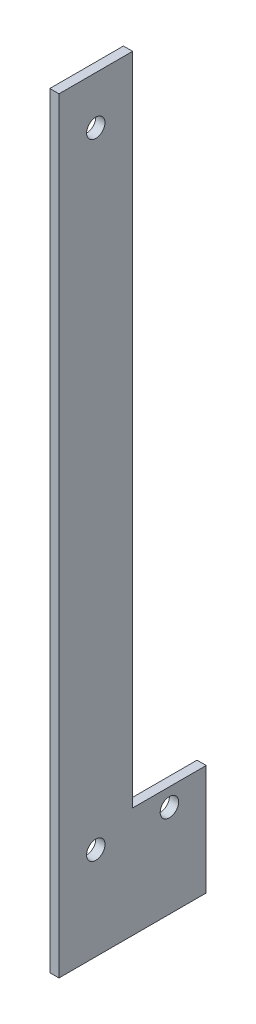
ISO-10303-21;
HEADER;
FILE_DESCRIPTION(('STEP AP214'),'2;1');
FILE_NAME('part.step','',(''),(''),'','','');
FILE_SCHEMA(('AUTOMOTIVE_DESIGN { 1 0 10303 214 1 1 1 1 }'));
ENDSEC;
DATA;
#1=APPLICATION_CONTEXT('core data for automotive mechanical design processes');
#2=APPLICATION_PROTOCOL_DEFINITION('international standard','automotive_design',2000,#1);
#3=PRODUCT_CONTEXT('',#1,'mechanical');
#4=PRODUCT('Part','Part','',(#3));
#5=PRODUCT_RELATED_PRODUCT_CATEGORY('part','',(#4));
#6=PRODUCT_DEFINITION_FORMATION('','',#4);
#7=PRODUCT_DEFINITION_CONTEXT('part definition',#1,'design');
#8=PRODUCT_DEFINITION('design','',#6,#7);
#9=PRODUCT_DEFINITION_SHAPE('','',#8);
#10=(LENGTH_UNIT() NAMED_UNIT(*) SI_UNIT(.MILLI.,.METRE.));
#11=(NAMED_UNIT(*) PLANE_ANGLE_UNIT() SI_UNIT($,.RADIAN.));
#12=(NAMED_UNIT(*) SI_UNIT($,.STERADIAN.) SOLID_ANGLE_UNIT());
#13=UNCERTAINTY_MEASURE_WITH_UNIT(LENGTH_MEASURE(1.E-05),#10,'distance_accuracy_value','');
#14=(GEOMETRIC_REPRESENTATION_CONTEXT(3) GLOBAL_UNCERTAINTY_ASSIGNED_CONTEXT((#13)) GLOBAL_UNIT_ASSIGNED_CONTEXT((#10,
#11,#12)) REPRESENTATION_CONTEXT('',''));
#15=CARTESIAN_POINT('',(0.,0.,0.));
#16=DIRECTION('',(0.,0.,1.));
#17=DIRECTION('',(1.,0.,0.));
#18=AXIS2_PLACEMENT_3D('',#15,#16,#17);
#19=CARTESIAN_POINT('',(3.175,38.1,-25.4));
#20=DIRECTION('',(0.,1.,0.));
#21=DIRECTION('',(0.,0.,1.));
#22=AXIS2_PLACEMENT_3D('',#19,#20,#21);
#23=PLANE('',#22);
#24=DIRECTION('',(0.,0.,-1.));
#25=VECTOR('',#24,1.);
#26=CARTESIAN_POINT('',(0.,38.1,-25.4));
#27=LINE('',#26,#25);
#28=CARTESIAN_POINT('',(0.,38.1,-25.4));
#29=VERTEX_POINT('',#28);
#30=CARTESIAN_POINT('',(0.,38.1,-50.8));
#31=VERTEX_POINT('',#30);
#32=EDGE_CURVE('E116',#29,#31,#27,.T.);
#33=ORIENTED_EDGE('',*,*,#32,.F.);
#34=DIRECTION('',(-1.,0.,0.));
#35=VECTOR('',#34,1.);
#36=CARTESIAN_POINT('',(3.175,38.1,-25.4));
#37=LINE('',#36,#35);
#38=CARTESIAN_POINT('',(3.175,38.1,-25.4));
#39=VERTEX_POINT('',#38);
#40=EDGE_CURVE('E11',#39,#29,#37,.T.);
#41=ORIENTED_EDGE('',*,*,#40,.F.);
#42=DIRECTION('',(0.,0.,-1.));
#43=VECTOR('',#42,1.);
#44=CARTESIAN_POINT('',(3.175,38.1,-25.4));
#45=LINE('',#44,#43);
#46=CARTESIAN_POINT('',(3.175,38.1,-50.8));
#47=VERTEX_POINT('',#46);
#48=EDGE_CURVE('E129',#39,#47,#45,.T.);
#49=ORIENTED_EDGE('',*,*,#48,.T.);
#50=DIRECTION('',(-1.,0.,0.));
#51=VECTOR('',#50,1.);
#52=CARTESIAN_POINT('',(3.175,38.1,-50.8));
#53=LINE('',#52,#51);
#54=EDGE_CURVE('E36',#47,#31,#53,.T.);
#55=ORIENTED_EDGE('',*,*,#54,.T.);
#56=EDGE_LOOP('',(#33,#41,#49,#55));
#57=FACE_BOUND('',#56,.T.);
#58=ADVANCED_FACE('F33',(#57),#23,.T.);
#59=CARTESIAN_POINT('',(3.175,38.1,-25.4));
#60=DIRECTION('',(0.,0.,1.));
#61=DIRECTION('',(1.,0.,0.));
#62=AXIS2_PLACEMENT_3D('',#59,#60,#61);
#63=PLANE('',#62);
#64=DIRECTION('',(0.,1.,0.));
#65=VECTOR('',#64,1.);
#66=CARTESIAN_POINT('',(0.,38.1,-25.4));
#67=LINE('',#66,#65);
#68=CARTESIAN_POINT('',(0.,264.16,-25.4));
#69=VERTEX_POINT('',#68);
#70=EDGE_CURVE('E128',#29,#69,#67,.T.);
#71=ORIENTED_EDGE('',*,*,#70,.T.);
#72=DIRECTION('',(-1.,0.,0.));
#73=VECTOR('',#72,1.);
#74=CARTESIAN_POINT('',(3.175,264.16,-25.4));
#75=LINE('',#74,#73);
#76=CARTESIAN_POINT('',(3.175,264.16,-25.4));
#77=VERTEX_POINT('',#76);
#78=EDGE_CURVE('E42',#77,#69,#75,.T.);
#79=ORIENTED_EDGE('',*,*,#78,.F.);
#80=DIRECTION('',(0.,1.,0.));
#81=VECTOR('',#80,1.);
#82=CARTESIAN_POINT('',(3.175,38.1,-25.4));
#83=LINE('',#82,#81);
#84=EDGE_CURVE('E106',#39,#77,#83,.T.);
#85=ORIENTED_EDGE('',*,*,#84,.F.);
#86=ORIENTED_EDGE('',*,*,#40,.T.);
#87=EDGE_LOOP('',(#71,#79,#85,#86));
#88=FACE_BOUND('',#87,.T.);
#89=ADVANCED_FACE('F141',(#88),#63,.F.);
#90=CARTESIAN_POINT('',(3.175,264.16,0.));
#91=DIRECTION('',(0.,1.,0.));
#92=DIRECTION('',(0.,0.,1.));
#93=AXIS2_PLACEMENT_3D('',#90,#91,#92);
#94=PLANE('',#93);
#95=DIRECTION('',(0.,0.,-1.));
#96=VECTOR('',#95,1.);
#97=CARTESIAN_POINT('',(0.,264.16,0.));
#98=LINE('',#97,#96);
#99=CARTESIAN_POINT('',(0.,264.16,0.));
#100=VERTEX_POINT('',#99);
#101=EDGE_CURVE('E96',#100,#69,#98,.T.);
#102=ORIENTED_EDGE('',*,*,#101,.F.);
#103=DIRECTION('',(-1.,0.,0.));
#104=VECTOR('',#103,1.);
#105=CARTESIAN_POINT('',(3.175,264.16,0.));
#106=LINE('',#105,#104);
#107=CARTESIAN_POINT('',(3.175,264.16,0.));
#108=VERTEX_POINT('',#107);
#109=EDGE_CURVE('E91',#108,#100,#106,.T.);
#110=ORIENTED_EDGE('',*,*,#109,.F.);
#111=DIRECTION('',(0.,0.,-1.));
#112=VECTOR('',#111,1.);
#113=CARTESIAN_POINT('',(3.175,264.16,0.));
#114=LINE('',#113,#112);
#115=EDGE_CURVE('E94',#108,#77,#114,.T.);
#116=ORIENTED_EDGE('',*,*,#115,.T.);
#117=ORIENTED_EDGE('',*,*,#78,.T.);
#118=EDGE_LOOP('',(#102,#110,#116,#117));
#119=FACE_BOUND('',#118,.T.);
#120=ADVANCED_FACE('F93',(#119),#94,.T.);
#121=CARTESIAN_POINT('',(3.175,0.,0.));
#122=DIRECTION('',(0.,0.,1.));
#123=DIRECTION('',(1.,0.,0.));
#124=AXIS2_PLACEMENT_3D('',#121,#122,#123);
#125=PLANE('',#124);
#126=DIRECTION('',(0.,1.,0.));
#127=VECTOR('',#126,1.);
#128=CARTESIAN_POINT('',(0.,0.,0.));
#129=LINE('',#128,#127);
#130=CARTESIAN_POINT('',(0.,0.,0.));
#131=VERTEX_POINT('',#130);
#132=EDGE_CURVE('E125',#131,#100,#129,.T.);
#133=ORIENTED_EDGE('',*,*,#132,.F.);
#134=DIRECTION('',(-1.,0.,0.));
#135=VECTOR('',#134,1.);
#136=CARTESIAN_POINT('',(3.175,0.,0.));
#137=LINE('',#136,#135);
#138=CARTESIAN_POINT('',(3.175,0.,0.));
#139=VERTEX_POINT('',#138);
#140=EDGE_CURVE('E101',#139,#131,#137,.T.);
#141=ORIENTED_EDGE('',*,*,#140,.F.);
#142=DIRECTION('',(0.,1.,0.));
#143=VECTOR('',#142,1.);
#144=CARTESIAN_POINT('',(3.175,0.,0.));
#145=LINE('',#144,#143);
#146=EDGE_CURVE('E105',#139,#108,#145,.T.);
#147=ORIENTED_EDGE('',*,*,#146,.T.);
#148=ORIENTED_EDGE('',*,*,#109,.T.);
#149=EDGE_LOOP('',(#133,#141,#147,#148));
#150=FACE_BOUND('',#149,.T.);
#151=ADVANCED_FACE('F109',(#150),#125,.T.);
#152=CARTESIAN_POINT('',(3.175,0.,0.));
#153=DIRECTION('',(0.,1.,0.));
#154=DIRECTION('',(0.,0.,1.));
#155=AXIS2_PLACEMENT_3D('',#152,#153,#154);
#156=PLANE('',#155);
#157=DIRECTION('',(0.,0.,-1.));
#158=VECTOR('',#157,1.);
#159=CARTESIAN_POINT('',(0.,0.,0.));
#160=LINE('',#159,#158);
#161=CARTESIAN_POINT('',(0.,0.,-50.8));
#162=VERTEX_POINT('',#161);
#163=EDGE_CURVE('E123',#131,#162,#160,.T.);
#164=ORIENTED_EDGE('',*,*,#163,.T.);
#165=DIRECTION('',(-1.,0.,0.));
#166=VECTOR('',#165,1.);
#167=CARTESIAN_POINT('',(3.175,0.,-50.8));
#168=LINE('',#167,#166);
#169=CARTESIAN_POINT('',(3.175,0.,-50.8));
#170=VERTEX_POINT('',#169);
#171=EDGE_CURVE('E132',#170,#162,#168,.T.);
#172=ORIENTED_EDGE('',*,*,#171,.F.);
#173=DIRECTION('',(0.,0.,-1.));
#174=VECTOR('',#173,1.);
#175=CARTESIAN_POINT('',(3.175,0.,-25.4));
#176=LINE('',#175,#174);
#177=EDGE_CURVE('E110',#139,#170,#176,.T.);
#178=ORIENTED_EDGE('',*,*,#177,.F.);
#179=ORIENTED_EDGE('',*,*,#140,.T.);
#180=EDGE_LOOP('',(#164,#172,#178,#179));
#181=FACE_BOUND('',#180,.T.);
#182=ADVANCED_FACE('F202',(#181),#156,.F.);
#183=CARTESIAN_POINT('',(3.175,0.,-50.8));
#184=DIRECTION('',(0.,0.,1.));
#185=DIRECTION('',(1.,0.,0.));
#186=AXIS2_PLACEMENT_3D('',#183,#184,#185);
#187=PLANE('',#186);
#188=DIRECTION('',(0.,1.,0.));
#189=VECTOR('',#188,1.);
#190=CARTESIAN_POINT('',(0.,0.,-50.8));
#191=LINE('',#190,#189);
#192=EDGE_CURVE('E119',#162,#31,#191,.T.);
#193=ORIENTED_EDGE('',*,*,#192,.T.);
#194=ORIENTED_EDGE('',*,*,#54,.F.);
#195=DIRECTION('',(0.,1.,0.));
#196=VECTOR('',#195,1.);
#197=CARTESIAN_POINT('',(3.175,0.,-50.8));
#198=LINE('',#197,#196);
#199=EDGE_CURVE('E84',#170,#47,#198,.T.);
#200=ORIENTED_EDGE('',*,*,#199,.F.);
#201=ORIENTED_EDGE('',*,*,#171,.T.);
#202=EDGE_LOOP('',(#193,#194,#200,#201));
#203=FACE_BOUND('',#202,.T.);
#204=ADVANCED_FACE('F137',(#203),#187,.F.);
#205=CARTESIAN_POINT('',(3.175,0.,0.));
#206=DIRECTION('',(1.,0.,0.));
#207=DIRECTION('',(0.,0.,-1.));
#208=AXIS2_PLACEMENT_3D('',#205,#206,#207);
#209=PLANE('',#208);
#210=CARTESIAN_POINT('',(3.175,31.9999999999999,-38.1));
#211=DIRECTION('',(1.,0.,0.));
#212=DIRECTION('',(0.,0.,-1.));
#213=AXIS2_PLACEMENT_3D('',#210,#211,#212);
#214=CIRCLE('',#213,3.175);
#215=CARTESIAN_POINT('',(3.175,31.9999999999999,-41.275));
#216=VERTEX_POINT('',#215);
#217=EDGE_CURVE('E156',#216,#216,#214,.T.);
#218=ORIENTED_EDGE('',*,*,#217,.F.);
#219=EDGE_LOOP('',(#218));
#220=FACE_BOUND('',#219,.T.);
#221=CARTESIAN_POINT('',(3.175,31.9999999999999,-12.7));
#222=DIRECTION('',(1.,0.,0.));
#223=DIRECTION('',(0.,0.,-1.));
#224=AXIS2_PLACEMENT_3D('',#221,#222,#223);
#225=CIRCLE('',#224,3.175);
#226=CARTESIAN_POINT('',(3.175,31.9999999999999,-15.875));
#227=VERTEX_POINT('',#226);
#228=EDGE_CURVE('E150',#227,#227,#225,.T.);
#229=ORIENTED_EDGE('',*,*,#228,.F.);
#230=EDGE_LOOP('',(#229));
#231=FACE_BOUND('',#230,.T.);
#232=CARTESIAN_POINT('',(3.175,247.65,-12.7));
#233=DIRECTION('',(1.,0.,0.));
#234=DIRECTION('',(0.,0.,-1.));
#235=AXIS2_PLACEMENT_3D('',#232,#233,#234);
#236=CIRCLE('',#235,3.175);
#237=CARTESIAN_POINT('',(3.175,247.65,-15.875));
#238=VERTEX_POINT('',#237);
#239=EDGE_CURVE('E144',#238,#238,#236,.T.);
#240=ORIENTED_EDGE('',*,*,#239,.F.);
#241=EDGE_LOOP('',(#240));
#242=FACE_BOUND('',#241,.T.);
#243=ORIENTED_EDGE('',*,*,#48,.F.);
#244=ORIENTED_EDGE('',*,*,#84,.T.);
#245=ORIENTED_EDGE('',*,*,#115,.F.);
#246=ORIENTED_EDGE('',*,*,#146,.F.);
#247=ORIENTED_EDGE('',*,*,#177,.T.);
#248=ORIENTED_EDGE('',*,*,#199,.T.);
#249=EDGE_LOOP('',(#243,#244,#245,#246,#247,#248));
#250=FACE_BOUND('',#249,.T.);
#251=ADVANCED_FACE('F104',(#220,#231,#242,#250),#209,.T.);
#252=CARTESIAN_POINT('',(0.,0.,0.));
#253=DIRECTION('',(1.,0.,0.));
#254=DIRECTION('',(0.,0.,-1.));
#255=AXIS2_PLACEMENT_3D('',#252,#253,#254);
#256=PLANE('',#255);
#257=CARTESIAN_POINT('',(0.,31.9999999999999,-38.1));
#258=DIRECTION('',(1.,0.,0.));
#259=DIRECTION('',(0.,0.,-1.));
#260=AXIS2_PLACEMENT_3D('',#257,#258,#259);
#261=CIRCLE('',#260,3.175);
#262=CARTESIAN_POINT('',(0.,31.9999999999999,-41.275));
#263=VERTEX_POINT('',#262);
#264=EDGE_CURVE('E147',#263,#263,#261,.T.);
#265=ORIENTED_EDGE('',*,*,#264,.T.);
#266=EDGE_LOOP('',(#265));
#267=FACE_BOUND('',#266,.T.);
#268=CARTESIAN_POINT('',(0.,31.9999999999999,-12.7));
#269=DIRECTION('',(1.,0.,0.));
#270=DIRECTION('',(0.,0.,-1.));
#271=AXIS2_PLACEMENT_3D('',#268,#269,#270);
#272=CIRCLE('',#271,3.175);
#273=CARTESIAN_POINT('',(0.,31.9999999999999,-15.875));
#274=VERTEX_POINT('',#273);
#275=EDGE_CURVE('E153',#274,#274,#272,.T.);
#276=ORIENTED_EDGE('',*,*,#275,.T.);
#277=EDGE_LOOP('',(#276));
#278=FACE_BOUND('',#277,.T.);
#279=CARTESIAN_POINT('',(0.,247.65,-12.7));
#280=DIRECTION('',(1.,0.,0.));
#281=DIRECTION('',(0.,0.,-1.));
#282=AXIS2_PLACEMENT_3D('',#279,#280,#281);
#283=CIRCLE('',#282,3.175);
#284=CARTESIAN_POINT('',(0.,247.65,-15.875));
#285=VERTEX_POINT('',#284);
#286=EDGE_CURVE('E120',#285,#285,#283,.T.);
#287=ORIENTED_EDGE('',*,*,#286,.T.);
#288=EDGE_LOOP('',(#287));
#289=FACE_BOUND('',#288,.T.);
#290=ORIENTED_EDGE('',*,*,#32,.T.);
#291=ORIENTED_EDGE('',*,*,#192,.F.);
#292=ORIENTED_EDGE('',*,*,#163,.F.);
#293=ORIENTED_EDGE('',*,*,#132,.T.);
#294=ORIENTED_EDGE('',*,*,#101,.T.);
#295=ORIENTED_EDGE('',*,*,#70,.F.);
#296=EDGE_LOOP('',(#290,#291,#292,#293,#294,#295));
#297=FACE_BOUND('',#296,.T.);
#298=ADVANCED_FACE('F140',(#267,#278,#289,#297),#256,.F.);
#299=CARTESIAN_POINT('',(0.,247.65,-12.7));
#300=DIRECTION('',(1.,0.,0.));
#301=DIRECTION('',(0.,0.,-1.));
#302=AXIS2_PLACEMENT_3D('',#299,#300,#301);
#303=CYLINDRICAL_SURFACE('',#302,3.175);
#304=ORIENTED_EDGE('',*,*,#286,.F.);
#305=EDGE_LOOP('',(#304));
#306=FACE_BOUND('',#305,.T.);
#307=ORIENTED_EDGE('',*,*,#239,.T.);
#308=EDGE_LOOP('',(#307));
#309=FACE_BOUND('',#308,.T.);
#310=ADVANCED_FACE('F178',(#306,#309),#303,.F.);
#311=CARTESIAN_POINT('',(0.,31.9999999999999,-12.7));
#312=DIRECTION('',(1.,0.,0.));
#313=DIRECTION('',(0.,0.,-1.));
#314=AXIS2_PLACEMENT_3D('',#311,#312,#313);
#315=CYLINDRICAL_SURFACE('',#314,3.175);
#316=ORIENTED_EDGE('',*,*,#275,.F.);
#317=EDGE_LOOP('',(#316));
#318=FACE_BOUND('',#317,.T.);
#319=ORIENTED_EDGE('',*,*,#228,.T.);
#320=EDGE_LOOP('',(#319));
#321=FACE_BOUND('',#320,.T.);
#322=ADVANCED_FACE('F167',(#318,#321),#315,.F.);
#323=CARTESIAN_POINT('',(0.,31.9999999999999,-38.1));
#324=DIRECTION('',(1.,0.,0.));
#325=DIRECTION('',(0.,0.,-1.));
#326=AXIS2_PLACEMENT_3D('',#323,#324,#325);
#327=CYLINDRICAL_SURFACE('',#326,3.175);
#328=ORIENTED_EDGE('',*,*,#264,.F.);
#329=EDGE_LOOP('',(#328));
#330=FACE_BOUND('',#329,.T.);
#331=ORIENTED_EDGE('',*,*,#217,.T.);
#332=EDGE_LOOP('',(#331));
#333=FACE_BOUND('',#332,.T.);
#334=ADVANCED_FACE('F164',(#330,#333),#327,.F.);
#335=CLOSED_SHELL('',(#58,#89,#120,#151,#182,#204,#251,#298,#310,#322,#334));
#336=MANIFOLD_SOLID_BREP('B2',#335);
#337=ADVANCED_BREP_SHAPE_REPRESENTATION('',(#18,#336),#14);
#338=SHAPE_DEFINITION_REPRESENTATION(#9,#337);
ENDSEC;
END-ISO-10303-21;
